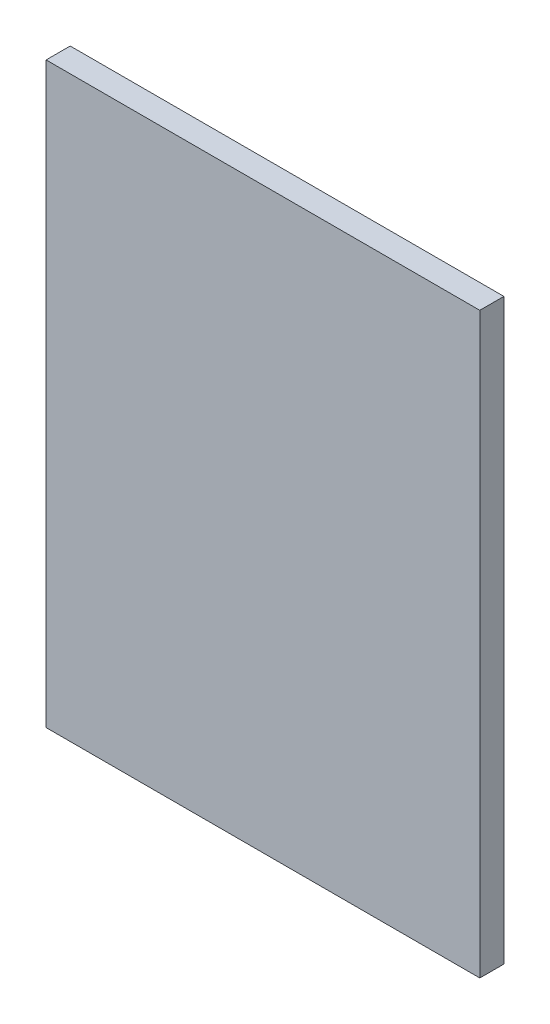
ISO-10303-21;
HEADER;
FILE_DESCRIPTION(('STEP AP214'),'2;1');
FILE_NAME('part.step','',(''),(''),'','','');
FILE_SCHEMA(('AUTOMOTIVE_DESIGN { 1 0 10303 214 1 1 1 1 }'));
ENDSEC;
DATA;
#1=APPLICATION_CONTEXT('core data for automotive mechanical design processes');
#2=APPLICATION_PROTOCOL_DEFINITION('international standard','automotive_design',2000,#1);
#3=PRODUCT_CONTEXT('',#1,'mechanical');
#4=PRODUCT('Part','Part','',(#3));
#5=PRODUCT_RELATED_PRODUCT_CATEGORY('part','',(#4));
#6=PRODUCT_DEFINITION_FORMATION('','',#4);
#7=PRODUCT_DEFINITION_CONTEXT('part definition',#1,'design');
#8=PRODUCT_DEFINITION('design','',#6,#7);
#9=PRODUCT_DEFINITION_SHAPE('','',#8);
#10=(LENGTH_UNIT() NAMED_UNIT(*) SI_UNIT(.MILLI.,.METRE.));
#11=(NAMED_UNIT(*) PLANE_ANGLE_UNIT() SI_UNIT($,.RADIAN.));
#12=(NAMED_UNIT(*) SI_UNIT($,.STERADIAN.) SOLID_ANGLE_UNIT());
#13=UNCERTAINTY_MEASURE_WITH_UNIT(LENGTH_MEASURE(1.E-05),#10,'distance_accuracy_value','');
#14=(GEOMETRIC_REPRESENTATION_CONTEXT(3) GLOBAL_UNCERTAINTY_ASSIGNED_CONTEXT((#13)) GLOBAL_UNIT_ASSIGNED_CONTEXT((#10,
#11,#12)) REPRESENTATION_CONTEXT('',''));
#15=CARTESIAN_POINT('',(0.,0.,0.));
#16=DIRECTION('',(0.,0.,1.));
#17=DIRECTION('',(1.,0.,0.));
#18=AXIS2_PLACEMENT_3D('',#15,#16,#17);
#19=CARTESIAN_POINT('',(0.,0.,12.7));
#20=DIRECTION('',(1.,0.,0.));
#21=DIRECTION('',(0.,0.,-1.));
#22=AXIS2_PLACEMENT_3D('',#19,#20,#21);
#23=PLANE('',#22);
#24=DIRECTION('',(0.,-1.,0.));
#25=VECTOR('',#24,1.);
#26=CARTESIAN_POINT('',(0.,0.,0.));
#27=LINE('',#26,#25);
#28=CARTESIAN_POINT('',(0.,304.8,0.));
#29=VERTEX_POINT('',#28);
#30=CARTESIAN_POINT('',(0.,0.,0.));
#31=VERTEX_POINT('',#30);
#32=EDGE_CURVE('E95',#29,#31,#27,.T.);
#33=ORIENTED_EDGE('',*,*,#32,.T.);
#34=DIRECTION('',(0.,0.,-1.));
#35=VECTOR('',#34,1.);
#36=CARTESIAN_POINT('',(0.,0.,12.7));
#37=LINE('',#36,#35);
#38=CARTESIAN_POINT('',(0.,0.,12.7));
#39=VERTEX_POINT('',#38);
#40=EDGE_CURVE('E11',#39,#31,#37,.T.);
#41=ORIENTED_EDGE('',*,*,#40,.F.);
#42=DIRECTION('',(0.,-1.,0.));
#43=VECTOR('',#42,1.);
#44=CARTESIAN_POINT('',(0.,0.,12.7));
#45=LINE('',#44,#43);
#46=CARTESIAN_POINT('',(0.,304.8,12.7));
#47=VERTEX_POINT('',#46);
#48=EDGE_CURVE('E83',#47,#39,#45,.T.);
#49=ORIENTED_EDGE('',*,*,#48,.F.);
#50=DIRECTION('',(0.,0.,-1.));
#51=VECTOR('',#50,1.);
#52=CARTESIAN_POINT('',(0.,304.8,12.7));
#53=LINE('',#52,#51);
#54=EDGE_CURVE('E91',#47,#29,#53,.T.);
#55=ORIENTED_EDGE('',*,*,#54,.T.);
#56=EDGE_LOOP('',(#33,#41,#49,#55));
#57=FACE_BOUND('',#56,.T.);
#58=ADVANCED_FACE('F32',(#57),#23,.F.);
#59=CARTESIAN_POINT('',(0.,0.,12.7));
#60=DIRECTION('',(0.,1.,0.));
#61=DIRECTION('',(0.,0.,1.));
#62=AXIS2_PLACEMENT_3D('',#59,#60,#61);
#63=PLANE('',#62);
#64=DIRECTION('',(1.,0.,0.));
#65=VECTOR('',#64,1.);
#66=CARTESIAN_POINT('',(0.,0.,0.));
#67=LINE('',#66,#65);
#68=CARTESIAN_POINT('',(228.6,0.,0.));
#69=VERTEX_POINT('',#68);
#70=EDGE_CURVE('E87',#31,#69,#67,.T.);
#71=ORIENTED_EDGE('',*,*,#70,.T.);
#72=DIRECTION('',(0.,0.,-1.));
#73=VECTOR('',#72,1.);
#74=CARTESIAN_POINT('',(228.6,0.,12.7));
#75=LINE('',#74,#73);
#76=CARTESIAN_POINT('',(228.6,0.,12.7));
#77=VERTEX_POINT('',#76);
#78=EDGE_CURVE('E40',#77,#69,#75,.T.);
#79=ORIENTED_EDGE('',*,*,#78,.F.);
#80=DIRECTION('',(1.,0.,0.));
#81=VECTOR('',#80,1.);
#82=CARTESIAN_POINT('',(0.,0.,12.7));
#83=LINE('',#82,#81);
#84=EDGE_CURVE('E78',#39,#77,#83,.T.);
#85=ORIENTED_EDGE('',*,*,#84,.F.);
#86=ORIENTED_EDGE('',*,*,#40,.T.);
#87=EDGE_LOOP('',(#71,#79,#85,#86));
#88=FACE_BOUND('',#87,.T.);
#89=ADVANCED_FACE('F86',(#88),#63,.F.);
#90=CARTESIAN_POINT('',(228.6,0.,12.7));
#91=DIRECTION('',(-1.,0.,0.));
#92=DIRECTION('',(0.,0.,1.));
#93=AXIS2_PLACEMENT_3D('',#90,#91,#92);
#94=PLANE('',#93);
#95=DIRECTION('',(0.,1.,0.));
#96=VECTOR('',#95,1.);
#97=CARTESIAN_POINT('',(228.6,0.,0.));
#98=LINE('',#97,#96);
#99=CARTESIAN_POINT('',(228.6,304.8,0.));
#100=VERTEX_POINT('',#99);
#101=EDGE_CURVE('E65',#69,#100,#98,.T.);
#102=ORIENTED_EDGE('',*,*,#101,.T.);
#103=DIRECTION('',(0.,0.,-1.));
#104=VECTOR('',#103,1.);
#105=CARTESIAN_POINT('',(228.6,304.8,12.7));
#106=LINE('',#105,#104);
#107=CARTESIAN_POINT('',(228.6,304.8,12.7));
#108=VERTEX_POINT('',#107);
#109=EDGE_CURVE('E88',#108,#100,#106,.T.);
#110=ORIENTED_EDGE('',*,*,#109,.F.);
#111=DIRECTION('',(0.,1.,0.));
#112=VECTOR('',#111,1.);
#113=CARTESIAN_POINT('',(228.6,0.,12.7));
#114=LINE('',#113,#112);
#115=EDGE_CURVE('E81',#77,#108,#114,.T.);
#116=ORIENTED_EDGE('',*,*,#115,.F.);
#117=ORIENTED_EDGE('',*,*,#78,.T.);
#118=EDGE_LOOP('',(#102,#110,#116,#117));
#119=FACE_BOUND('',#118,.T.);
#120=ADVANCED_FACE('F89',(#119),#94,.F.);
#121=CARTESIAN_POINT('',(0.,304.8,12.7));
#122=DIRECTION('',(0.,-1.,0.));
#123=DIRECTION('',(0.,0.,-1.));
#124=AXIS2_PLACEMENT_3D('',#121,#122,#123);
#125=PLANE('',#124);
#126=DIRECTION('',(-1.,0.,0.));
#127=VECTOR('',#126,1.);
#128=CARTESIAN_POINT('',(0.,304.8,0.));
#129=LINE('',#128,#127);
#130=EDGE_CURVE('E71',#100,#29,#129,.T.);
#131=ORIENTED_EDGE('',*,*,#130,.T.);
#132=ORIENTED_EDGE('',*,*,#54,.F.);
#133=DIRECTION('',(-1.,0.,0.));
#134=VECTOR('',#133,1.);
#135=CARTESIAN_POINT('',(0.,304.8,12.7));
#136=LINE('',#135,#134);
#137=EDGE_CURVE('E48',#108,#47,#136,.T.);
#138=ORIENTED_EDGE('',*,*,#137,.F.);
#139=ORIENTED_EDGE('',*,*,#109,.T.);
#140=EDGE_LOOP('',(#131,#132,#138,#139));
#141=FACE_BOUND('',#140,.T.);
#142=ADVANCED_FACE('F102',(#141),#125,.F.);
#143=CARTESIAN_POINT('',(0.,0.,12.7));
#144=DIRECTION('',(0.,0.,-1.));
#145=DIRECTION('',(-1.,0.,0.));
#146=AXIS2_PLACEMENT_3D('',#143,#144,#145);
#147=PLANE('',#146);
#148=ORIENTED_EDGE('',*,*,#48,.T.);
#149=ORIENTED_EDGE('',*,*,#84,.T.);
#150=ORIENTED_EDGE('',*,*,#115,.T.);
#151=ORIENTED_EDGE('',*,*,#137,.T.);
#152=EDGE_LOOP('',(#148,#149,#150,#151));
#153=FACE_BOUND('',#152,.T.);
#154=ADVANCED_FACE('F79',(#153),#147,.F.);
#155=CARTESIAN_POINT('',(0.,0.,0.));
#156=DIRECTION('',(0.,0.,-1.));
#157=DIRECTION('',(-1.,0.,0.));
#158=AXIS2_PLACEMENT_3D('',#155,#156,#157);
#159=PLANE('',#158);
#160=ORIENTED_EDGE('',*,*,#32,.F.);
#161=ORIENTED_EDGE('',*,*,#130,.F.);
#162=ORIENTED_EDGE('',*,*,#101,.F.);
#163=ORIENTED_EDGE('',*,*,#70,.F.);
#164=EDGE_LOOP('',(#160,#161,#162,#163));
#165=FACE_BOUND('',#164,.T.);
#166=ADVANCED_FACE('F105',(#165),#159,.T.);
#167=CLOSED_SHELL('',(#58,#89,#120,#142,#154,#166));
#168=MANIFOLD_SOLID_BREP('B2',#167);
#169=ADVANCED_BREP_SHAPE_REPRESENTATION('',(#18,#168),#14);
#170=SHAPE_DEFINITION_REPRESENTATION(#9,#169);
ENDSEC;
END-ISO-10303-21;
